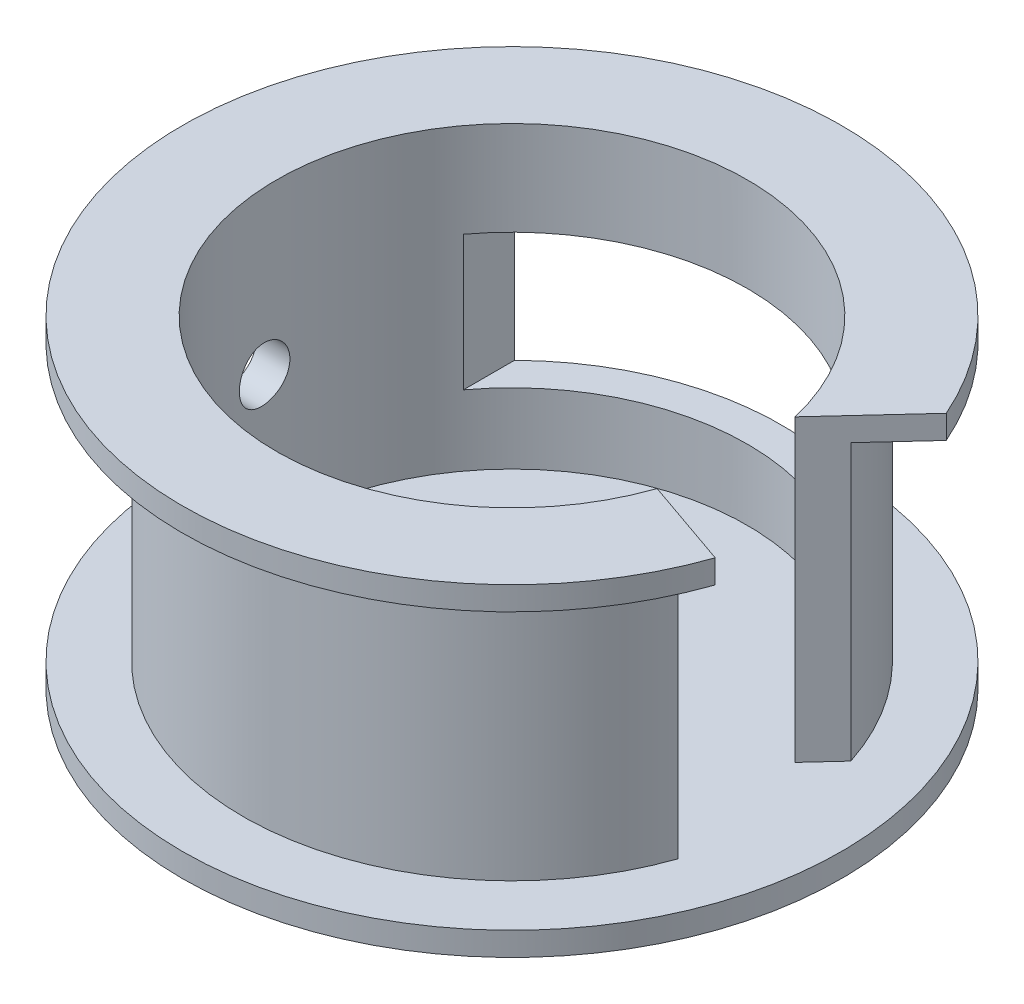
ISO-10303-21;
HEADER;
FILE_DESCRIPTION(('STEP AP214'),'2;1');
FILE_NAME('part.step','',(''),(''),'','','');
FILE_SCHEMA(('AUTOMOTIVE_DESIGN { 1 0 10303 214 1 1 1 1 }'));
ENDSEC;
DATA;
#1=APPLICATION_CONTEXT('core data for automotive mechanical design processes');
#2=APPLICATION_PROTOCOL_DEFINITION('international standard','automotive_design',2000,#1);
#3=PRODUCT_CONTEXT('',#1,'mechanical');
#4=PRODUCT('Part','Part','',(#3));
#5=PRODUCT_RELATED_PRODUCT_CATEGORY('part','',(#4));
#6=PRODUCT_DEFINITION_FORMATION('','',#4);
#7=PRODUCT_DEFINITION_CONTEXT('part definition',#1,'design');
#8=PRODUCT_DEFINITION('design','',#6,#7);
#9=PRODUCT_DEFINITION_SHAPE('','',#8);
#10=(LENGTH_UNIT() NAMED_UNIT(*) SI_UNIT(.MILLI.,.METRE.));
#11=(NAMED_UNIT(*) PLANE_ANGLE_UNIT() SI_UNIT($,.RADIAN.));
#12=(NAMED_UNIT(*) SI_UNIT($,.STERADIAN.) SOLID_ANGLE_UNIT());
#13=UNCERTAINTY_MEASURE_WITH_UNIT(LENGTH_MEASURE(1.E-05),#10,'distance_accuracy_value','');
#14=(GEOMETRIC_REPRESENTATION_CONTEXT(3) GLOBAL_UNCERTAINTY_ASSIGNED_CONTEXT((#13)) GLOBAL_UNIT_ASSIGNED_CONTEXT((#10,
#11,#12)) REPRESENTATION_CONTEXT('',''));
#15=CARTESIAN_POINT('',(0.,0.,0.));
#16=DIRECTION('',(0.,0.,1.));
#17=DIRECTION('',(1.,0.,0.));
#18=AXIS2_PLACEMENT_3D('',#15,#16,#17);
#19=CARTESIAN_POINT('',(0.,4.45,0.));
#20=DIRECTION('',(0.,-1.,0.));
#21=DIRECTION('',(0.,0.,-1.));
#22=AXIS2_PLACEMENT_3D('',#19,#20,#21);
#23=CYLINDRICAL_SURFACE('',#22,4.);
#24=CARTESIAN_POINT('',(-3.99534911147019,2.4,-0.192835363650814));
#25=CARTESIAN_POINT('',(-3.99534932264498,2.42245997848048,-0.192834403466887));
#26=CARTESIAN_POINT('',(-3.99544211356392,2.44493476388355,-0.190937436705672));
#27=CARTESIAN_POINT('',(-3.99579518005218,2.48926295752838,-0.183397333965403));
#28=CARTESIAN_POINT('',(-3.99605563975488,2.51111565501048,-0.177750079215068));
#29=CARTESIAN_POINT('',(-3.99668963822955,2.55355304140388,-0.162871296443627));
#30=CARTESIAN_POINT('',(-3.99706312228736,2.57413833806374,-0.153641502090994));
#31=CARTESIAN_POINT('',(-3.99784075922583,2.61346310874395,-0.131861432544158));
#32=CARTESIAN_POINT('',(-3.99824490549815,2.63220297850169,-0.119311871385149));
#33=CARTESIAN_POINT('',(-3.99898400931056,2.66732750141926,-0.0912342834419309));
#34=CARTESIAN_POINT('',(-3.99931890929095,2.68371019180449,-0.0757037993305588));
#35=CARTESIAN_POINT('',(-3.99981353451901,2.71363685983541,-0.0421102356403634));
#36=CARTESIAN_POINT('',(-3.99997325534998,2.72718076590136,-0.0240470922198968));
#37=CARTESIAN_POINT('',(-4.00002053194073,2.75103008328336,0.0140768897029784));
#38=CARTESIAN_POINT('',(-3.99990838357964,2.7613390014898,0.034135533686074));
#39=CARTESIAN_POINT('',(-3.99933767998811,2.77844447958886,0.0756934908608061));
#40=CARTESIAN_POINT('',(-3.99887913372069,2.78524113035343,0.0971927667631036));
#41=CARTESIAN_POINT('',(-3.99757551116795,2.79511722495767,0.14095239383968));
#42=CARTESIAN_POINT('',(-3.99673154540938,2.7982072567045,0.163210389529349));
#43=CARTESIAN_POINT('',(-3.99465560607912,2.80062508793229,0.207911416657236));
#44=CARTESIAN_POINT('',(-3.99342363298967,2.79995289208925,0.230354447865443));
#45=CARTESIAN_POINT('',(-3.9906111916957,2.79487384799206,0.274806831987976));
#46=CARTESIAN_POINT('',(-3.98903048120361,2.7904643971735,0.296815871745647));
#47=CARTESIAN_POINT('',(-3.98560166871129,2.77804183512756,0.339770393912073));
#48=CARTESIAN_POINT('',(-3.98375355562939,2.77002857452236,0.360715832194516));
#49=CARTESIAN_POINT('',(-3.97989218682111,2.75056895298958,0.401088938820277));
#50=CARTESIAN_POINT('',(-3.97787799063411,2.73910190484029,0.420506546264157));
#51=CARTESIAN_POINT('',(-3.97383445677498,2.71307452697779,0.457143243769552));
#52=CARTESIAN_POINT('',(-3.9718051185276,2.69851407916249,0.474362249851048));
#53=CARTESIAN_POINT('',(-3.96787397908535,2.66662658728011,0.506196691755041));
#54=CARTESIAN_POINT('',(-3.96597282132291,2.64928687655696,0.52079952589336));
#55=CARTESIAN_POINT('',(-3.96246046873887,2.61237293089557,0.546882807703129));
#56=CARTESIAN_POINT('',(-3.96084926704249,2.59279874895395,0.55836332940698));
#57=CARTESIAN_POINT('',(-3.95805760152393,2.5520574702566,0.577820636536353));
#58=CARTESIAN_POINT('',(-3.95687527190779,2.53089776865666,0.585812630353435));
#59=CARTESIAN_POINT('',(-3.95503302904363,2.48751423694454,0.598124461835611));
#60=CARTESIAN_POINT('',(-3.95437307927068,2.46529048134654,0.602444556242428));
#61=CARTESIAN_POINT('',(-3.95363724506823,2.42065349328222,0.607254872945857));
#62=CARTESIAN_POINT('',(-3.95355545210776,2.39824452788987,0.607783839826872));
#63=CARTESIAN_POINT('',(-3.95396735791715,2.35365798946016,0.60509826904729));
#64=CARTESIAN_POINT('',(-3.95446103949129,2.33148040952876,0.601883843242805));
#65=CARTESIAN_POINT('',(-3.95597798317536,2.28807966045115,0.591830725575611));
#66=CARTESIAN_POINT('',(-3.9569990417389,2.26685291637348,0.585007111202165));
#67=CARTESIAN_POINT('',(-3.95948358582549,2.22584659902333,0.567946837611822));
#68=CARTESIAN_POINT('',(-3.9609470884894,2.20606708185518,0.557710046162444));
#69=CARTESIAN_POINT('',(-3.96420864988401,2.16836465930827,0.534034668497361));
#70=CARTESIAN_POINT('',(-3.96600896820169,2.15045564747587,0.520574274482616));
#71=CARTESIAN_POINT('',(-3.96979477202377,2.11714038586224,0.49086974120127));
#72=CARTESIAN_POINT('',(-3.97178026857543,2.10173428554898,0.474625435804997));
#73=CARTESIAN_POINT('',(-3.97580636603239,2.07370838835762,0.439632023877154));
#74=CARTESIAN_POINT('',(-3.97784731413696,2.06111697597143,0.420860214671215));
#75=CARTESIAN_POINT('',(-3.98181889266822,2.0392653491573,0.381457600394265));
#76=CARTESIAN_POINT('',(-3.9837495217771,2.03000517451504,0.360826773124287));
#77=CARTESIAN_POINT('',(-3.9873772201722,2.01507005207991,0.318244993130526));
#78=CARTESIAN_POINT('',(-3.98907387832771,2.00940135392772,0.296291811610379));
#79=CARTESIAN_POINT('',(-3.9921341567633,2.00184732388101,0.251721236264395));
#80=CARTESIAN_POINT('',(-3.99349778880042,1.99996185840754,0.229103865918446));
#81=CARTESIAN_POINT('',(-3.99582958679443,2.00003908102379,0.183991890065851));
#82=CARTESIAN_POINT('',(-3.99680008494047,2.00197866245668,0.161497365533389));
#83=CARTESIAN_POINT('',(-3.99834598444348,2.00961283106975,0.117140982920844));
#84=CARTESIAN_POINT('',(-3.99892139660769,2.01530731552955,0.0952791075508783));
#85=CARTESIAN_POINT('',(-3.99970573845225,2.03025480303169,0.052923324815362));
#86=CARTESIAN_POINT('',(-3.99991646863598,2.03949004672686,0.0324231800379426));
#87=CARTESIAN_POINT('',(-4.00004231611188,2.0612593238491,-0.00674356609507596));
#88=CARTESIAN_POINT('',(-3.99995744197996,2.0737932615665,-0.0254102206267436));
#89=CARTESIAN_POINT('',(-3.99958238074377,2.1018150620036,-0.0603955231631876));
#90=CARTESIAN_POINT('',(-3.99929204570698,2.11730504721461,-0.0767124691768425));
#91=CARTESIAN_POINT('',(-3.99860914233559,2.1508002467454,-0.106526682395014));
#92=CARTESIAN_POINT('',(-3.99821654945564,2.16880606446829,-0.12002327121477));
#93=CARTESIAN_POINT('',(-3.99743043177665,2.20688194382329,-0.143850478900249));
#94=CARTESIAN_POINT('',(-3.99703690803558,2.22695845119323,-0.154170787504897));
#95=CARTESIAN_POINT('',(-3.99634024837037,2.26854576232041,-0.171285258479846));
#96=CARTESIAN_POINT('',(-3.99603701359808,2.29005496574828,-0.178083283120462));
#97=CARTESIAN_POINT('',(-3.9956611247825,2.32640186082641,-0.18628518376205));
#98=CARTESIAN_POINT('',(-3.99554509586146,2.34101096167194,-0.188738216065666));
#99=CARTESIAN_POINT('',(-3.99538901966478,2.37041123265825,-0.192013621779233));
#100=CARTESIAN_POINT('',(-3.99534897233918,2.38520240267933,-0.192835996261175));
#101=CARTESIAN_POINT('',(-3.99534911147019,2.4,-0.192835363650814));
#102=B_SPLINE_CURVE_WITH_KNOTS('',3,(#24,#25,#26,#27,#28,#29,#30,#31,#32,#33,#34,#35,#36,#37,
#38,#39,#40,#41,#42,#43,#44,#45,#46,#47,#48,#49,#50,#51,#52,#53,#54,#55,#56,#57,#58,#59,#60,#61,
#62,#63,#64,#65,#66,#67,#68,#69,#70,#71,#72,#73,#74,#75,#76,#77,#78,#79,#80,#81,#82,#83,#84,#85,
#86,#87,#88,#89,#90,#91,#92,#93,#94,#95,#96,#97,#98,#99,#100,#101),.UNSPECIFIED.,.T.,.F.,(4,2,2,
2,2,2,2,2,2,2,2,2,2,2,2,2,2,2,2,2,2,2,2,2,2,2,2,2,2,2,2,2,2,2,2,2,2,2,4),(0.,0.06732605161125,
0.134726166925505,0.202093706447434,0.269446767922985,0.33685559230006,0.404266116180914,
0.471603309162272,0.538938759859443,0.606081406199794,0.673223969090138,0.740413327438181,
0.807605471040284,0.875208362737293,0.942813835891311,1.01073667671582,1.0786579068977,
1.14627999992134,1.21389736437283,1.28082269409087,1.34774602406811,1.41439196272079,
1.48104048365439,1.5481532964549,1.61527011560216,1.6830359615758,1.75080261686441,
1.81868687346876,1.88656873316347,1.95404178254266,2.0215129861832,2.0886501112219,
2.15578528853103,2.22296885262742,2.29016855793414,2.35758414840307,2.42492565875006,
2.46928297889366,2.51364026987681),.UNSPECIFIED.);
#103=CARTESIAN_POINT('',(-3.99534911147019,2.4,-0.192835363650814));
#104=VERTEX_POINT('',#103);
#105=EDGE_CURVE('E240',#104,#104,#102,.T.);
#106=ORIENTED_EDGE('',*,*,#105,.T.);
#107=EDGE_LOOP('',(#106));
#108=FACE_BOUND('',#107,.T.);
#109=CARTESIAN_POINT('',(0.,3.4,0.));
#110=DIRECTION('',(0.,1.,0.));
#111=DIRECTION('',(0.,0.,1.));
#112=AXIS2_PLACEMENT_3D('',#109,#110,#111);
#113=CIRCLE('',#112,4.);
#114=CARTESIAN_POINT('',(1.85392404770425,3.4,-3.54442740443981));
#115=VERTEX_POINT('',#114);
#116=CARTESIAN_POINT('',(-2.80967038048585,3.4,-2.847060300208));
#117=VERTEX_POINT('',#116);
#118=EDGE_CURVE('E145',#115,#117,#113,.T.);
#119=ORIENTED_EDGE('',*,*,#118,.T.);
#120=DIRECTION('',(0.,-1.,0.));
#121=VECTOR('',#120,1.);
#122=CARTESIAN_POINT('',(-2.80967038048585,4.45,-2.847060300208));
#123=LINE('',#122,#121);
#124=CARTESIAN_POINT('',(-2.80967038048585,1.39654629268362,-2.847060300208));
#125=VERTEX_POINT('',#124);
#126=EDGE_CURVE('E136',#117,#125,#123,.T.);
#127=ORIENTED_EDGE('',*,*,#126,.T.);
#128=CARTESIAN_POINT('',(0.,1.39654629268362,0.));
#129=DIRECTION('',(0.,-1.,0.));
#130=DIRECTION('',(0.,0.,-1.));
#131=AXIS2_PLACEMENT_3D('',#128,#129,#130);
#132=CIRCLE('',#131,4.);
#133=CARTESIAN_POINT('',(1.85392404770425,1.39654629268362,-3.54442740443981));
#134=VERTEX_POINT('',#133);
#135=EDGE_CURVE('E124',#125,#134,#132,.T.);
#136=ORIENTED_EDGE('',*,*,#135,.T.);
#137=DIRECTION('',(0.,-1.,0.));
#138=VECTOR('',#137,1.);
#139=CARTESIAN_POINT('',(1.85392404770425,4.45,-3.54442740443981));
#140=LINE('',#139,#138);
#141=EDGE_CURVE('E130',#134,#115,#140,.F.);
#142=ORIENTED_EDGE('',*,*,#141,.T.);
#143=EDGE_LOOP('',(#119,#127,#136,#142));
#144=FACE_BOUND('',#143,.T.);
#145=DIRECTION('',(0.,-1.,0.));
#146=VECTOR('',#145,1.);
#147=CARTESIAN_POINT('',(3.80513367959762,4.45,-1.23327113012178));
#148=LINE('',#147,#146);
#149=CARTESIAN_POINT('',(3.80513367959762,0.349999999999999,-1.23327113012178));
#150=VERTEX_POINT('',#149);
#151=CARTESIAN_POINT('',(3.80513367959762,4.45,-1.23327113012178));
#152=VERTEX_POINT('',#151);
#153=EDGE_CURVE('E191',#150,#152,#148,.F.);
#154=ORIENTED_EDGE('',*,*,#153,.F.);
#155=CARTESIAN_POINT('',(0.,0.35,0.));
#156=DIRECTION('',(0.,1.,0.));
#157=DIRECTION('',(0.,0.,1.));
#158=AXIS2_PLACEMENT_3D('',#155,#156,#157);
#159=CIRCLE('',#158,4.);
#160=CARTESIAN_POINT('',(3.77879679881127,0.349999999999999,1.31175255032865));
#161=VERTEX_POINT('',#160);
#162=EDGE_CURVE('E203',#150,#161,#159,.T.);
#163=ORIENTED_EDGE('',*,*,#162,.T.);
#164=DIRECTION('',(0.,-1.,0.));
#165=VECTOR('',#164,1.);
#166=CARTESIAN_POINT('',(3.77879679881127,4.45,1.31175255032865));
#167=LINE('',#166,#165);
#168=CARTESIAN_POINT('',(3.77879679881127,4.45,1.31175255032865));
#169=VERTEX_POINT('',#168);
#170=EDGE_CURVE('E184',#161,#169,#167,.F.);
#171=ORIENTED_EDGE('',*,*,#170,.T.);
#172=CARTESIAN_POINT('',(0.,4.45,0.));
#173=DIRECTION('',(0.,1.,0.));
#174=DIRECTION('',(0.,0.,1.));
#175=AXIS2_PLACEMENT_3D('',#172,#173,#174);
#176=CIRCLE('',#175,4.);
#177=EDGE_CURVE('E207',#152,#169,#176,.T.);
#178=ORIENTED_EDGE('',*,*,#177,.F.);
#179=EDGE_LOOP('',(#154,#163,#171,#178));
#180=FACE_BOUND('',#179,.T.);
#181=ADVANCED_FACE('F43',(#108,#144,#180),#23,.T.);
#182=CARTESIAN_POINT('',(0.,4.8,0.));
#183=DIRECTION('',(0.,1.,0.));
#184=DIRECTION('',(0.,0.,1.));
#185=AXIS2_PLACEMENT_3D('',#182,#183,#184);
#186=PLANE('',#185);
#187=CARTESIAN_POINT('',(0.,4.8,0.));
#188=DIRECTION('',(0.,1.,0.));
#189=DIRECTION('',(0.,0.,1.));
#190=AXIS2_PLACEMENT_3D('',#187,#188,#189);
#191=CIRCLE('',#190,3.5);
#192=CARTESIAN_POINT('',(3.40707065796343,4.8,-0.801167605214189));
#193=VERTEX_POINT('',#192);
#194=CARTESIAN_POINT('',(3.30644719895986,4.8,1.14778348153757));
#195=VERTEX_POINT('',#194);
#196=EDGE_CURVE('E194',#193,#195,#191,.T.);
#197=ORIENTED_EDGE('',*,*,#196,.F.);
#198=DIRECTION('',(0.677542914464982,0.,-0.735483241860953));
#199=VECTOR('',#198,1.);
#200=CARTESIAN_POINT('',(1.44376679728076,4.8,1.33002889523663));
#201=LINE('',#200,#199);
#202=CARTESIAN_POINT('',(4.48566742097738,4.8,-1.9720009605429));
#203=VERTEX_POINT('',#202);
#204=EDGE_CURVE('E151',#193,#203,#201,.T.);
#205=ORIENTED_EDGE('',*,*,#204,.T.);
#206=CARTESIAN_POINT('',(0.,4.8,0.));
#207=DIRECTION('',(0.,1.,0.));
#208=DIRECTION('',(0.,0.,1.));
#209=AXIS2_PLACEMENT_3D('',#206,#207,#208);
#210=CIRCLE('',#209,4.9);
#211=CARTESIAN_POINT('',(4.6290260785438,4.8,1.6068968741526));
#212=VERTEX_POINT('',#211);
#213=EDGE_CURVE('E199',#203,#212,#210,.T.);
#214=ORIENTED_EDGE('',*,*,#213,.T.);
#215=DIRECTION('',(0.944699199702817,0.,0.327938137582162));
#216=VECTOR('',#215,1.);
#217=CARTESIAN_POINT('',(0.,4.8,0.));
#218=LINE('',#217,#216);
#219=EDGE_CURVE('E147',#195,#212,#218,.T.);
#220=ORIENTED_EDGE('',*,*,#219,.F.);
#221=EDGE_LOOP('',(#197,#205,#214,#220));
#222=FACE_BOUND('',#221,.T.);
#223=ADVANCED_FACE('F286',(#222),#186,.T.);
#224=CARTESIAN_POINT('',(0.,4.45,0.));
#225=DIRECTION('',(0.,1.,0.));
#226=DIRECTION('',(0.,0.,1.));
#227=AXIS2_PLACEMENT_3D('',#224,#225,#226);
#228=PLANE('',#227);
#229=DIRECTION('',(0.677542914464982,0.,-0.735483241860953));
#230=VECTOR('',#229,1.);
#231=CARTESIAN_POINT('',(1.44376679728076,4.45,1.33002889523663));
#232=LINE('',#231,#230);
#233=CARTESIAN_POINT('',(4.48566742097738,4.45,-1.9720009605429));
#234=VERTEX_POINT('',#233);
#235=EDGE_CURVE('E188',#152,#234,#232,.T.);
#236=ORIENTED_EDGE('',*,*,#235,.F.);
#237=ORIENTED_EDGE('',*,*,#177,.T.);
#238=DIRECTION('',(0.944699199702817,0.,0.327938137582162));
#239=VECTOR('',#238,1.);
#240=CARTESIAN_POINT('',(0.,4.45,0.));
#241=LINE('',#240,#239);
#242=CARTESIAN_POINT('',(4.6290260785438,4.45,1.6068968741526));
#243=VERTEX_POINT('',#242);
#244=EDGE_CURVE('E171',#169,#243,#241,.T.);
#245=ORIENTED_EDGE('',*,*,#244,.T.);
#246=CARTESIAN_POINT('',(0.,4.45,0.));
#247=DIRECTION('',(0.,1.,0.));
#248=DIRECTION('',(0.,0.,1.));
#249=AXIS2_PLACEMENT_3D('',#246,#247,#248);
#250=CIRCLE('',#249,4.9);
#251=EDGE_CURVE('E198',#234,#243,#250,.T.);
#252=ORIENTED_EDGE('',*,*,#251,.F.);
#253=EDGE_LOOP('',(#236,#237,#245,#252));
#254=FACE_BOUND('',#253,.T.);
#255=ADVANCED_FACE('F294',(#254),#228,.F.);
#256=CARTESIAN_POINT('',(0.,4.8,0.));
#257=DIRECTION('',(0.,-1.,0.));
#258=DIRECTION('',(0.,0.,-1.));
#259=AXIS2_PLACEMENT_3D('',#256,#257,#258);
#260=CYLINDRICAL_SURFACE('',#259,4.9);
#261=DIRECTION('',(0.,1.,0.));
#262=VECTOR('',#261,1.);
#263=CARTESIAN_POINT('',(4.48566742097738,0.349999999999999,-1.9720009605429));
#264=LINE('',#263,#262);
#265=EDGE_CURVE('E172',#234,#203,#264,.T.);
#266=ORIENTED_EDGE('',*,*,#265,.F.);
#267=ORIENTED_EDGE('',*,*,#251,.T.);
#268=DIRECTION('',(0.,1.,0.));
#269=VECTOR('',#268,1.);
#270=CARTESIAN_POINT('',(4.6290260785438,0.349999999999999,1.6068968741526));
#271=LINE('',#270,#269);
#272=EDGE_CURVE('E175',#243,#212,#271,.T.);
#273=ORIENTED_EDGE('',*,*,#272,.T.);
#274=ORIENTED_EDGE('',*,*,#213,.F.);
#275=EDGE_LOOP('',(#266,#267,#273,#274));
#276=FACE_BOUND('',#275,.T.);
#277=ADVANCED_FACE('F271',(#276),#260,.T.);
#278=CARTESIAN_POINT('',(0.,4.45,0.));
#279=DIRECTION('',(0.,-1.,0.));
#280=DIRECTION('',(0.,0.,-1.));
#281=AXIS2_PLACEMENT_3D('',#278,#279,#280);
#282=CYLINDRICAL_SURFACE('',#281,3.5);
#283=CARTESIAN_POINT('',(-3.4946837514324,2.4,-0.192835363650814));
#284=CARTESIAN_POINT('',(-3.49468398956314,2.42245746790633,-0.192834416504622));
#285=CARTESIAN_POINT('',(-3.49479005186782,2.44492928922739,-0.190937895193295));
#286=CARTESIAN_POINT('',(-3.49519358539553,2.48925089710394,-0.183399858959187));
#287=CARTESIAN_POINT('',(-3.49549126094243,2.51109999362383,-0.177754346152419));
#288=CARTESIAN_POINT('',(-3.49621581890233,2.55353022760768,-0.16288051693422));
#289=CARTESIAN_POINT('',(-3.49664263856328,2.57411197505309,-0.153653939973174));
#290=CARTESIAN_POINT('',(-3.4975313302014,2.61343075239996,-0.131881513105359));
#291=CARTESIAN_POINT('',(-3.49799319498557,2.63216815904775,-0.119336343031459));
#292=CARTESIAN_POINT('',(-3.49883802023143,2.66729322026625,-0.0912650452744653));
#293=CARTESIAN_POINT('',(-3.49922089736596,2.68367838788371,-0.0757358025849059));
#294=CARTESIAN_POINT('',(-3.49978649144674,2.71361035603359,-0.0421436773594813));
#295=CARTESIAN_POINT('',(-3.49996920420483,2.72715709717108,-0.0240807418185213));
#296=CARTESIAN_POINT('',(-3.50002359102391,2.75100797999979,0.014037384448989));
#297=CARTESIAN_POINT('',(-3.49989570443471,2.76131667867555,0.0340897226276151));
#298=CARTESIAN_POINT('',(-3.49924430078869,2.77842324818344,0.075633508415927));
#299=CARTESIAN_POINT('',(-3.49872079683296,2.78522123526208,0.0971249083488492));
#300=CARTESIAN_POINT('',(-3.49723300960981,2.79509785168264,0.140846406084365));
#301=CARTESIAN_POINT('',(-3.49627037930101,2.79819027258776,0.163073446365248));
#302=CARTESIAN_POINT('',(-3.49390280157995,2.80062359134394,0.207708027410494));
#303=CARTESIAN_POINT('',(-3.49249785462637,2.79996449308538,0.230115567987652));
#304=CARTESIAN_POINT('',(-3.48929019692635,2.79492456340684,0.274498744011316));
#305=CARTESIAN_POINT('',(-3.4874871293097,2.79054038276509,0.296473972568244));
#306=CARTESIAN_POINT('',(-3.48357537204853,2.77818239294473,0.339362171610595));
#307=CARTESIAN_POINT('',(-3.48146666620577,2.77020839346539,0.360275085716002));
#308=CARTESIAN_POINT('',(-3.47705524855406,2.75082346973017,0.400627532282054));
#309=CARTESIAN_POINT('',(-3.4747511256157,2.73938568345444,0.420054006449728));
#310=CARTESIAN_POINT('',(-3.47012311139232,2.71341641387571,0.456713826196183));
#311=CARTESIAN_POINT('',(-3.46779921910989,2.69888477358122,0.473947060412431));
#312=CARTESIAN_POINT('',(-3.46329116202863,2.66702644858798,0.50584176647948));
#313=CARTESIAN_POINT('',(-3.46110795093664,2.64968302322132,0.520486662922951));
#314=CARTESIAN_POINT('',(-3.45707213873705,2.61274569041936,0.546651682019412));
#315=CARTESIAN_POINT('',(-3.45521952750207,2.59315185195191,0.558171900397267));
#316=CARTESIAN_POINT('',(-3.4520100890629,2.55238069237775,0.577688575843079));
#317=CARTESIAN_POINT('',(-3.45065050345192,2.53121300567453,0.585704691379517));
#318=CARTESIAN_POINT('',(-3.44853053116781,2.48780229363509,0.598060932610731));
#319=CARTESIAN_POINT('',(-3.44777008890153,2.46555936827118,0.602401399363494));
#320=CARTESIAN_POINT('',(-3.44692173958982,2.42094954062238,0.607236806556629));
#321=CARTESIAN_POINT('',(-3.44682494662245,2.39858830516208,0.607782557688555));
#322=CARTESIAN_POINT('',(-3.44728876984405,2.3540943396549,0.605146156470507));
#323=CARTESIAN_POINT('',(-3.44784936054567,2.33196160078258,0.601964148648966));
#324=CARTESIAN_POINT('',(-3.44957418504939,2.28867633963363,0.591999182934811));
#325=CARTESIAN_POINT('',(-3.45073509341937,2.26751910965918,0.58523605758072));
#326=CARTESIAN_POINT('',(-3.45356064401217,2.22664085709657,0.568323811124171));
#327=CARTESIAN_POINT('',(-3.45522531136681,2.20691990622327,0.558174521088149));
#328=CARTESIAN_POINT('',(-3.45893978267305,2.1692762413527,0.534675447756169));
#329=CARTESIAN_POINT('',(-3.46099295046972,2.15137150588251,0.521297406329186));
#330=CARTESIAN_POINT('',(-3.46531200020627,2.11804758748749,0.491767117989678));
#331=CARTESIAN_POINT('',(-3.46757789863719,2.10262859751172,0.475614655921304));
#332=CARTESIAN_POINT('',(-3.47218175570334,2.07451179362319,0.440756433756762));
#333=CARTESIAN_POINT('',(-3.47452026388984,2.06185099417787,0.42202087362461));
#334=CARTESIAN_POINT('',(-3.47907334363111,2.03985560190707,0.382675306033722));
#335=CARTESIAN_POINT('',(-3.48128791310489,2.03052106491757,0.362065267116524));
#336=CARTESIAN_POINT('',(-3.48545299318632,2.01543061203252,0.319492613880098));
#337=CARTESIAN_POINT('',(-3.48740286892532,2.00968318516648,0.297526925220111));
#338=CARTESIAN_POINT('',(-3.49092203124523,2.00198026595968,0.252910707678881));
#339=CARTESIAN_POINT('',(-3.4924913356685,2.0000245958195,0.230260210959587));
#340=CARTESIAN_POINT('',(-3.49517428168386,1.99997605684226,0.185106194535527));
#341=CARTESIAN_POINT('',(-3.49629139696432,2.0018530438517,0.162602913671324));
#342=CARTESIAN_POINT('',(-3.49807357962179,2.00936646896726,0.118214775086994));
#343=CARTESIAN_POINT('',(-3.49873866354942,2.01500276941541,0.0963298947529546));
#344=CARTESIAN_POINT('',(-3.49964798380225,2.02982938483675,0.0539510003023679));
#345=CARTESIAN_POINT('',(-3.49989493498384,2.03899629504812,0.0334488502107899));
#346=CARTESIAN_POINT('',(-3.50005020738643,2.06062682823932,-0.00573596434424785));
#347=CARTESIAN_POINT('',(-3.49995853751813,2.07309036446133,-0.0244186766724308));
#348=CARTESIAN_POINT('',(-3.49953897565964,2.10097418865792,-0.059453633154541));
#349=CARTESIAN_POINT('',(-3.4992108671101,2.1163971777512,-0.0758037243512765));
#350=CARTESIAN_POINT('',(-3.49843568577698,2.14976208676201,-0.105697573780274));
#351=CARTESIAN_POINT('',(-3.49798858471485,2.16770460496592,-0.119240663566313));
#352=CARTESIAN_POINT('',(-3.49709061875377,2.20567671012634,-0.143184456018811));
#353=CARTESIAN_POINT('',(-3.4966397459439,2.22571446882221,-0.15357218741013));
#354=CARTESIAN_POINT('',(-3.49583939731351,2.26723684456696,-0.170827925853648));
#355=CARTESIAN_POINT('',(-3.49548981384274,2.28871989540599,-0.177699675684378));
#356=CARTESIAN_POINT('',(-3.49505154478464,2.32526172861212,-0.186078970889296));
#357=CARTESIAN_POINT('',(-3.4949148039654,2.3400935705616,-0.188609157511885));
#358=CARTESIAN_POINT('',(-3.49473082765161,2.36994813233534,-0.191987669991715));
#359=CARTESIAN_POINT('',(-3.49468359206884,2.38497085197145,-0.192835997506794));
#360=CARTESIAN_POINT('',(-3.4946837514324,2.4,-0.192835363650814));
#361=B_SPLINE_CURVE_WITH_KNOTS('',3,(#283,#284,#285,#286,#287,#288,#289,#290,#291,#292,#293,
#294,#295,#296,#297,#298,#299,#300,#301,#302,#303,#304,#305,#306,#307,#308,#309,#310,#311,#312,
#313,#314,#315,#316,#317,#318,#319,#320,#321,#322,#323,#324,#325,#326,#327,#328,#329,#330,#331,
#332,#333,#334,#335,#336,#337,#338,#339,#340,#341,#342,#343,#344,#345,#346,#347,#348,#349,#350,
#351,#352,#353,#354,#355,#356,#357,#358,#359,#360),.UNSPECIFIED.,.T.,.F.,(4,2,2,2,2,2,2,2,2,2,2,
2,2,2,2,2,2,2,2,2,2,2,2,2,2,2,2,2,2,2,2,2,2,2,2,2,2,2,4),(0.,0.06731771442127,0.134707331251999,
0.20206425542935,0.269407391824996,0.336821211892774,0.404236442474456,0.471556368239345,
0.538874064767268,0.60594042887005,0.673006723424085,0.740133381172702,0.807263597807606,
0.874928360475006,0.942596557475095,1.01068352070593,1.0787683978493,1.14646624838774,
1.21415781665476,1.2809412285419,1.34772205126418,1.41413684573786,1.48055495409822,
1.5475768969627,1.61460403971606,1.68248175107902,1.75036060181072,1.81839948725231,
1.88643518220234,1.95393783242306,2.02143801097756,2.08849821888859,2.15555666214136,
2.222676603879,2.28981251092859,2.35722078219143,2.42455714696507,2.46960803589345,
2.51465888041435),.UNSPECIFIED.);
#362=CARTESIAN_POINT('',(-3.4946837514324,2.4,-0.192835363650814));
#363=VERTEX_POINT('',#362);
#364=EDGE_CURVE('E47',#363,#363,#361,.T.);
#365=ORIENTED_EDGE('',*,*,#364,.F.);
#366=EDGE_LOOP('',(#365));
#367=FACE_BOUND('',#366,.T.);
#368=DIRECTION('',(0.,-1.,0.));
#369=VECTOR('',#368,1.);
#370=CARTESIAN_POINT('',(-2.80967038048585,4.45,-2.08704392695039));
#371=LINE('',#370,#369);
#372=CARTESIAN_POINT('',(-2.80967038048585,3.4,-2.08704392695039));
#373=VERTEX_POINT('',#372);
#374=CARTESIAN_POINT('',(-2.80967038048585,1.39654629268362,-2.08704392695039));
#375=VERTEX_POINT('',#374);
#376=EDGE_CURVE('E11',#373,#375,#371,.T.);
#377=ORIENTED_EDGE('',*,*,#376,.F.);
#378=CARTESIAN_POINT('',(0.,3.4,0.));
#379=DIRECTION('',(0.,1.,0.));
#380=DIRECTION('',(0.,0.,1.));
#381=AXIS2_PLACEMENT_3D('',#378,#379,#380);
#382=CIRCLE('',#381,3.5);
#383=CARTESIAN_POINT('',(1.85392404770425,3.4,-2.96866394617914));
#384=VERTEX_POINT('',#383);
#385=EDGE_CURVE('E58',#384,#373,#382,.T.);
#386=ORIENTED_EDGE('',*,*,#385,.F.);
#387=DIRECTION('',(0.,-1.,0.));
#388=VECTOR('',#387,1.);
#389=CARTESIAN_POINT('',(1.85392404770425,4.45,-2.96866394617914));
#390=LINE('',#389,#388);
#391=CARTESIAN_POINT('',(1.85392404770425,1.39654629268362,-2.96866394617914));
#392=VERTEX_POINT('',#391);
#393=EDGE_CURVE('E229',#392,#384,#390,.F.);
#394=ORIENTED_EDGE('',*,*,#393,.F.);
#395=CARTESIAN_POINT('',(0.,1.39654629268362,0.));
#396=DIRECTION('',(0.,-1.,0.));
#397=DIRECTION('',(0.,0.,-1.));
#398=AXIS2_PLACEMENT_3D('',#395,#396,#397);
#399=CIRCLE('',#398,3.5);
#400=EDGE_CURVE('E226',#375,#392,#399,.T.);
#401=ORIENTED_EDGE('',*,*,#400,.F.);
#402=EDGE_LOOP('',(#377,#386,#394,#401));
#403=FACE_BOUND('',#402,.T.);
#404=CARTESIAN_POINT('',(0.,0.35,0.));
#405=DIRECTION('',(0.,1.,0.));
#406=DIRECTION('',(0.,0.,1.));
#407=AXIS2_PLACEMENT_3D('',#404,#405,#406);
#408=CIRCLE('',#407,3.5);
#409=CARTESIAN_POINT('',(3.30644719895986,0.349999999999999,1.14778348153757));
#410=VERTEX_POINT('',#409);
#411=CARTESIAN_POINT('',(3.40707065796343,0.35,-0.801167605214189));
#412=VERTEX_POINT('',#411);
#413=EDGE_CURVE('E219',#410,#412,#408,.F.);
#414=ORIENTED_EDGE('',*,*,#413,.T.);
#415=DIRECTION('',(0.,1.,0.));
#416=VECTOR('',#415,1.);
#417=CARTESIAN_POINT('',(3.40707065796343,0.349999999999999,-0.801167605214189));
#418=LINE('',#417,#416);
#419=EDGE_CURVE('E167',#412,#193,#418,.T.);
#420=ORIENTED_EDGE('',*,*,#419,.T.);
#421=ORIENTED_EDGE('',*,*,#196,.T.);
#422=DIRECTION('',(0.,1.,0.));
#423=VECTOR('',#422,1.);
#424=CARTESIAN_POINT('',(3.30644719895986,0.349999999999999,1.14778348153757));
#425=LINE('',#424,#423);
#426=EDGE_CURVE('E162',#410,#195,#425,.T.);
#427=ORIENTED_EDGE('',*,*,#426,.F.);
#428=EDGE_LOOP('',(#414,#420,#421,#427));
#429=FACE_BOUND('',#428,.T.);
#430=ADVANCED_FACE('F268',(#367,#403,#429),#282,.F.);
#431=CARTESIAN_POINT('',(0.,0.35,0.));
#432=DIRECTION('',(0.,-1.,0.));
#433=DIRECTION('',(0.,0.,-1.));
#434=AXIS2_PLACEMENT_3D('',#431,#432,#433);
#435=CYLINDRICAL_SURFACE('',#434,4.9);
#436=CARTESIAN_POINT('',(0.,0.35,0.));
#437=DIRECTION('',(0.,1.,0.));
#438=DIRECTION('',(0.,0.,1.));
#439=AXIS2_PLACEMENT_3D('',#436,#437,#438);
#440=CIRCLE('',#439,4.9);
#441=CARTESIAN_POINT('',(0.,0.35,4.9));
#442=VERTEX_POINT('',#441);
#443=EDGE_CURVE('E215',#442,#442,#440,.T.);
#444=ORIENTED_EDGE('',*,*,#443,.F.);
#445=EDGE_LOOP('',(#444));
#446=FACE_BOUND('',#445,.T.);
#447=CARTESIAN_POINT('',(0.,0.,0.));
#448=DIRECTION('',(0.,1.,0.));
#449=DIRECTION('',(0.,0.,1.));
#450=AXIS2_PLACEMENT_3D('',#447,#448,#449);
#451=CIRCLE('',#450,4.9);
#452=CARTESIAN_POINT('',(0.,0.,4.9));
#453=VERTEX_POINT('',#452);
#454=EDGE_CURVE('E211',#453,#453,#451,.T.);
#455=ORIENTED_EDGE('',*,*,#454,.T.);
#456=EDGE_LOOP('',(#455));
#457=FACE_BOUND('',#456,.T.);
#458=ADVANCED_FACE('F45',(#446,#457),#435,.T.);
#459=CARTESIAN_POINT('',(0.,0.35,0.));
#460=DIRECTION('',(0.,1.,0.));
#461=DIRECTION('',(0.,0.,1.));
#462=AXIS2_PLACEMENT_3D('',#459,#460,#461);
#463=PLANE('',#462);
#464=CARTESIAN_POINT('',(0.,0.35,0.));
#465=DIRECTION('',(0.,1.,0.));
#466=DIRECTION('',(0.,0.,1.));
#467=AXIS2_PLACEMENT_3D('',#464,#465,#466);
#468=CIRCLE('',#467,1.6);
#469=CARTESIAN_POINT('',(0.,0.35,1.6));
#470=VERTEX_POINT('',#469);
#471=EDGE_CURVE('E235',#470,#470,#468,.T.);
#472=ORIENTED_EDGE('',*,*,#471,.F.);
#473=EDGE_LOOP('',(#472));
#474=FACE_BOUND('',#473,.T.);
#475=ORIENTED_EDGE('',*,*,#443,.T.);
#476=EDGE_LOOP('',(#475));
#477=FACE_BOUND('',#476,.T.);
#478=ORIENTED_EDGE('',*,*,#162,.F.);
#479=DIRECTION('',(0.677542914464982,0.,-0.735483241860953));
#480=VECTOR('',#479,1.);
#481=CARTESIAN_POINT('',(1.44376679728076,0.349999999999999,1.33002889523663));
#482=LINE('',#481,#480);
#483=EDGE_CURVE('E160',#412,#150,#482,.T.);
#484=ORIENTED_EDGE('',*,*,#483,.F.);
#485=ORIENTED_EDGE('',*,*,#413,.F.);
#486=DIRECTION('',(0.944699199702817,0.,0.327938137582162));
#487=VECTOR('',#486,1.);
#488=CARTESIAN_POINT('',(0.,0.349999999999999,0.));
#489=LINE('',#488,#487);
#490=EDGE_CURVE('E156',#410,#161,#489,.T.);
#491=ORIENTED_EDGE('',*,*,#490,.T.);
#492=EDGE_LOOP('',(#478,#484,#485,#491));
#493=FACE_BOUND('',#492,.T.);
#494=ADVANCED_FACE('F279',(#474,#477,#493),#463,.T.);
#495=CARTESIAN_POINT('',(0.,0.,0.));
#496=DIRECTION('',(0.,1.,0.));
#497=DIRECTION('',(0.,0.,1.));
#498=AXIS2_PLACEMENT_3D('',#495,#496,#497);
#499=PLANE('',#498);
#500=CARTESIAN_POINT('',(0.,0.,0.));
#501=DIRECTION('',(0.,1.,0.));
#502=DIRECTION('',(0.,0.,1.));
#503=AXIS2_PLACEMENT_3D('',#500,#501,#502);
#504=CIRCLE('',#503,1.6);
#505=CARTESIAN_POINT('',(0.,0.,1.6));
#506=VERTEX_POINT('',#505);
#507=EDGE_CURVE('E141',#506,#506,#504,.T.);
#508=ORIENTED_EDGE('',*,*,#507,.T.);
#509=EDGE_LOOP('',(#508));
#510=FACE_BOUND('',#509,.T.);
#511=ORIENTED_EDGE('',*,*,#454,.F.);
#512=EDGE_LOOP('',(#511));
#513=FACE_BOUND('',#512,.T.);
#514=ADVANCED_FACE('F307',(#510,#513),#499,.F.);
#515=CARTESIAN_POINT('',(1.44376679728076,0.349999999999999,1.33002889523663));
#516=DIRECTION('',(0.735483241860953,0.,0.677542914464982));
#517=DIRECTION('',(0.677542914464982,0.,-0.735483241860953));
#518=AXIS2_PLACEMENT_3D('',#515,#516,#517);
#519=PLANE('',#518);
#520=ORIENTED_EDGE('',*,*,#153,.T.);
#521=ORIENTED_EDGE('',*,*,#235,.T.);
#522=ORIENTED_EDGE('',*,*,#265,.T.);
#523=ORIENTED_EDGE('',*,*,#204,.F.);
#524=ORIENTED_EDGE('',*,*,#419,.F.);
#525=ORIENTED_EDGE('',*,*,#483,.T.);
#526=EDGE_LOOP('',(#520,#521,#522,#523,#524,#525));
#527=FACE_BOUND('',#526,.T.);
#528=ADVANCED_FACE('F282',(#527),#519,.T.);
#529=CARTESIAN_POINT('',(0.,0.349999999999999,0.));
#530=DIRECTION('',(-0.327938137582162,0.,0.944699199702817));
#531=DIRECTION('',(0.944699199702817,0.,0.327938137582162));
#532=AXIS2_PLACEMENT_3D('',#529,#530,#531);
#533=PLANE('',#532);
#534=ORIENTED_EDGE('',*,*,#490,.F.);
#535=ORIENTED_EDGE('',*,*,#426,.T.);
#536=ORIENTED_EDGE('',*,*,#219,.T.);
#537=ORIENTED_EDGE('',*,*,#272,.F.);
#538=ORIENTED_EDGE('',*,*,#244,.F.);
#539=ORIENTED_EDGE('',*,*,#170,.F.);
#540=EDGE_LOOP('',(#534,#535,#536,#537,#538,#539));
#541=FACE_BOUND('',#540,.T.);
#542=ADVANCED_FACE('F291',(#541),#533,.F.);
#543=CARTESIAN_POINT('',(-2.80967038048585,3.4,-11.45));
#544=DIRECTION('',(-1.,0.,0.));
#545=DIRECTION('',(0.,0.,1.));
#546=AXIS2_PLACEMENT_3D('',#543,#544,#545);
#547=PLANE('',#546);
#548=DIRECTION('',(0.,0.,1.));
#549=VECTOR('',#548,1.);
#550=CARTESIAN_POINT('',(-2.80967038048585,3.4,-11.45));
#551=LINE('',#550,#549);
#552=EDGE_CURVE('E131',#117,#373,#551,.T.);
#553=ORIENTED_EDGE('',*,*,#552,.T.);
#554=ORIENTED_EDGE('',*,*,#376,.T.);
#555=DIRECTION('',(0.,0.,1.));
#556=VECTOR('',#555,1.);
#557=CARTESIAN_POINT('',(-2.80967038048585,1.39654629268362,-11.45));
#558=LINE('',#557,#556);
#559=EDGE_CURVE('E71',#125,#375,#558,.T.);
#560=ORIENTED_EDGE('',*,*,#559,.F.);
#561=ORIENTED_EDGE('',*,*,#126,.F.);
#562=EDGE_LOOP('',(#553,#554,#560,#561));
#563=FACE_BOUND('',#562,.T.);
#564=ADVANCED_FACE('F135',(#563),#547,.F.);
#565=CARTESIAN_POINT('',(1.85392404770425,3.4,-11.45));
#566=DIRECTION('',(0.,1.,0.));
#567=DIRECTION('',(0.,0.,1.));
#568=AXIS2_PLACEMENT_3D('',#565,#566,#567);
#569=PLANE('',#568);
#570=DIRECTION('',(0.,0.,1.));
#571=VECTOR('',#570,1.);
#572=CARTESIAN_POINT('',(1.85392404770425,3.4,-11.45));
#573=LINE('',#572,#571);
#574=EDGE_CURVE('E254',#115,#384,#573,.T.);
#575=ORIENTED_EDGE('',*,*,#574,.T.);
#576=ORIENTED_EDGE('',*,*,#385,.T.);
#577=ORIENTED_EDGE('',*,*,#552,.F.);
#578=ORIENTED_EDGE('',*,*,#118,.F.);
#579=EDGE_LOOP('',(#575,#576,#577,#578));
#580=FACE_BOUND('',#579,.T.);
#581=ADVANCED_FACE('F266',(#580),#569,.F.);
#582=CARTESIAN_POINT('',(1.85392404770425,3.4,-11.45));
#583=DIRECTION('',(1.,0.,0.));
#584=DIRECTION('',(0.,1.,0.));
#585=AXIS2_PLACEMENT_3D('',#582,#583,#584);
#586=PLANE('',#585);
#587=DIRECTION('',(0.,0.,1.));
#588=VECTOR('',#587,1.);
#589=CARTESIAN_POINT('',(1.85392404770425,1.39654629268362,-11.45));
#590=LINE('',#589,#588);
#591=EDGE_CURVE('E66',#134,#392,#590,.T.);
#592=ORIENTED_EDGE('',*,*,#591,.T.);
#593=ORIENTED_EDGE('',*,*,#393,.T.);
#594=ORIENTED_EDGE('',*,*,#574,.F.);
#595=ORIENTED_EDGE('',*,*,#141,.F.);
#596=EDGE_LOOP('',(#592,#593,#594,#595));
#597=FACE_BOUND('',#596,.T.);
#598=ADVANCED_FACE('F262',(#597),#586,.F.);
#599=CARTESIAN_POINT('',(1.85392404770425,1.39654629268362,-11.45));
#600=DIRECTION('',(0.,-1.,0.));
#601=DIRECTION('',(0.,0.,-1.));
#602=AXIS2_PLACEMENT_3D('',#599,#600,#601);
#603=PLANE('',#602);
#604=ORIENTED_EDGE('',*,*,#559,.T.);
#605=ORIENTED_EDGE('',*,*,#400,.T.);
#606=ORIENTED_EDGE('',*,*,#591,.F.);
#607=ORIENTED_EDGE('',*,*,#135,.F.);
#608=EDGE_LOOP('',(#604,#605,#606,#607));
#609=FACE_BOUND('',#608,.T.);
#610=ADVANCED_FACE('F125',(#609),#603,.F.);
#611=CARTESIAN_POINT('',(0.,-11.1,0.));
#612=DIRECTION('',(0.,1.,0.));
#613=DIRECTION('',(0.,0.,1.));
#614=AXIS2_PLACEMENT_3D('',#611,#612,#613);
#615=CYLINDRICAL_SURFACE('',#614,1.6);
#616=ORIENTED_EDGE('',*,*,#471,.T.);
#617=EDGE_LOOP('',(#616));
#618=FACE_BOUND('',#617,.T.);
#619=ORIENTED_EDGE('',*,*,#507,.F.);
#620=EDGE_LOOP('',(#619));
#621=FACE_BOUND('',#620,.T.);
#622=ADVANCED_FACE('F351',(#618,#621),#615,.F.);
#623=CARTESIAN_POINT('',(-11.45,2.4,0.207164636349186));
#624=DIRECTION('',(1.,0.,0.));
#625=DIRECTION('',(0.,0.,-1.));
#626=AXIS2_PLACEMENT_3D('',#623,#624,#625);
#627=CYLINDRICAL_SURFACE('',#626,0.4);
#628=ORIENTED_EDGE('',*,*,#364,.T.);
#629=EDGE_LOOP('',(#628));
#630=FACE_BOUND('',#629,.T.);
#631=ORIENTED_EDGE('',*,*,#105,.F.);
#632=EDGE_LOOP('',(#631));
#633=FACE_BOUND('',#632,.T.);
#634=ADVANCED_FACE('F355',(#630,#633),#627,.F.);
#635=CLOSED_SHELL('',(#181,#223,#255,#277,#430,#458,#494,#514,#528,#542,#564,#581,#598,#610,
#622,#634));
#636=MANIFOLD_SOLID_BREP('B2',#635);
#637=ADVANCED_BREP_SHAPE_REPRESENTATION('',(#18,#636),#14);
#638=SHAPE_DEFINITION_REPRESENTATION(#9,#637);
ENDSEC;
END-ISO-10303-21;
